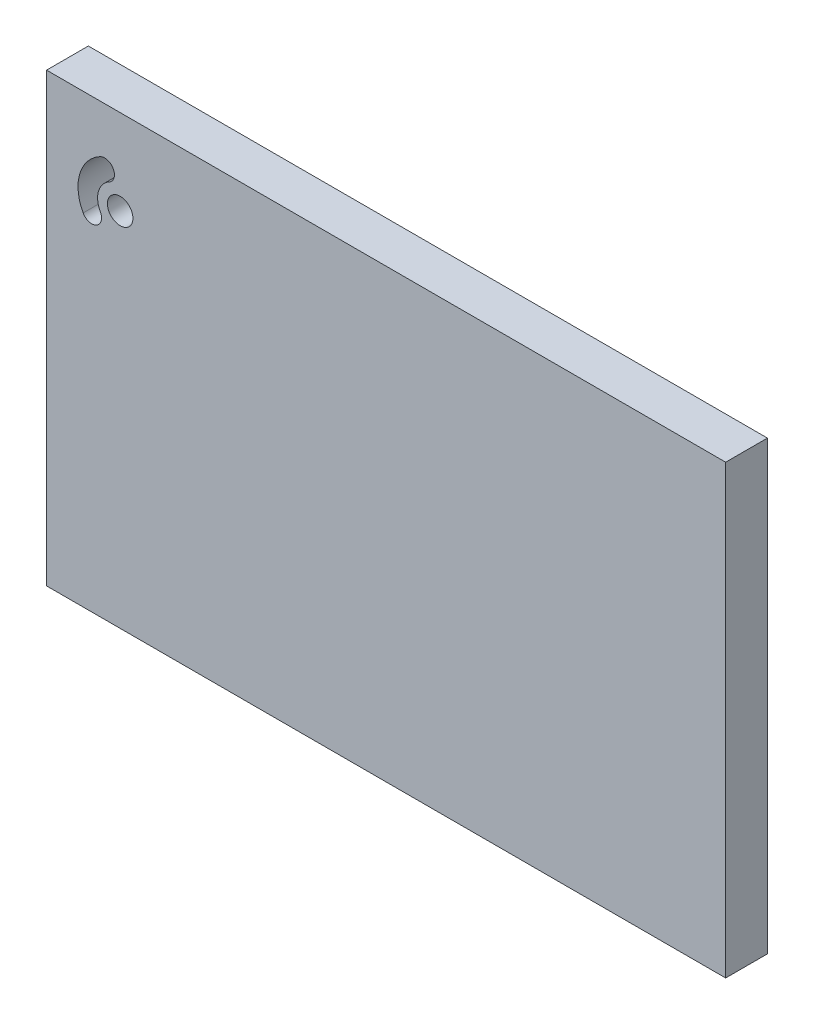
ISO-10303-21;
HEADER;
FILE_DESCRIPTION(('STEP AP214'),'2;1');
FILE_NAME('part.step','',(''),(''),'','','');
FILE_SCHEMA(('AUTOMOTIVE_DESIGN { 1 0 10303 214 1 1 1 1 }'));
ENDSEC;
DATA;
#1=APPLICATION_CONTEXT('core data for automotive mechanical design processes');
#2=APPLICATION_PROTOCOL_DEFINITION('international standard','automotive_design',2000,#1);
#3=PRODUCT_CONTEXT('',#1,'mechanical');
#4=PRODUCT('Part','Part','',(#3));
#5=PRODUCT_RELATED_PRODUCT_CATEGORY('part','',(#4));
#6=PRODUCT_DEFINITION_FORMATION('','',#4);
#7=PRODUCT_DEFINITION_CONTEXT('part definition',#1,'design');
#8=PRODUCT_DEFINITION('design','',#6,#7);
#9=PRODUCT_DEFINITION_SHAPE('','',#8);
#10=(LENGTH_UNIT() NAMED_UNIT(*) SI_UNIT(.MILLI.,.METRE.));
#11=(NAMED_UNIT(*) PLANE_ANGLE_UNIT() SI_UNIT($,.RADIAN.));
#12=(NAMED_UNIT(*) SI_UNIT($,.STERADIAN.) SOLID_ANGLE_UNIT());
#13=UNCERTAINTY_MEASURE_WITH_UNIT(LENGTH_MEASURE(1.E-05),#10,'distance_accuracy_value','');
#14=(GEOMETRIC_REPRESENTATION_CONTEXT(3) GLOBAL_UNCERTAINTY_ASSIGNED_CONTEXT((#13)) GLOBAL_UNIT_ASSIGNED_CONTEXT((#10,
#11,#12)) REPRESENTATION_CONTEXT('',''));
#15=CARTESIAN_POINT('',(0.,0.,0.));
#16=DIRECTION('',(0.,0.,1.));
#17=DIRECTION('',(1.,0.,0.));
#18=AXIS2_PLACEMENT_3D('',#15,#16,#17);
#19=CARTESIAN_POINT('',(0.,0.,10.));
#20=DIRECTION('',(0.,0.,1.));
#21=DIRECTION('',(1.,0.,0.));
#22=AXIS2_PLACEMENT_3D('',#19,#20,#21);
#23=PLANE('',#22);
#24=CARTESIAN_POINT('',(-22.101373353219,28.4381307481979,10.));
#25=DIRECTION('',(0.,0.,1.));
#26=DIRECTION('',(1.,0.,0.));
#27=AXIS2_PLACEMENT_3D('',#24,#25,#26);
#28=CIRCLE('',#27,10.0923388057999);
#29=CARTESIAN_POINT('',(-26.9341112939265,37.2981503061616,10.));
#30=VERTEX_POINT('',#29);
#31=CARTESIAN_POINT('',(-30.9613929111828,23.6053928074904,10.));
#32=VERTEX_POINT('',#31);
#33=EDGE_CURVE('E110',#30,#32,#28,.T.);
#34=ORIENTED_EDGE('',*,*,#33,.F.);
#35=CARTESIAN_POINT('',(-25.8106947551578,35.2385533184191,10.));
#36=DIRECTION('',(0.,0.,1.));
#37=DIRECTION('',(1.,0.,0.));
#38=AXIS2_PLACEMENT_3D('',#35,#36,#37);
#39=CIRCLE('',#38,2.34606148075814);
#40=CARTESIAN_POINT('',(-24.6872782163892,33.1789563306765,10.));
#41=VERTEX_POINT('',#40);
#42=EDGE_CURVE('E102',#41,#30,#39,.T.);
#43=ORIENTED_EDGE('',*,*,#42,.F.);
#44=CARTESIAN_POINT('',(-22.101373353219,28.4381307481979,10.));
#45=DIRECTION('',(0.,0.,-1.));
#46=DIRECTION('',(1.,0.,0.));
#47=AXIS2_PLACEMENT_3D('',#44,#45,#46);
#48=CIRCLE('',#47,5.40021584428362);
#49=CARTESIAN_POINT('',(-26.8421989356977,25.8522258850277,10.));
#50=VERTEX_POINT('',#49);
#51=EDGE_CURVE('E125',#50,#41,#48,.T.);
#52=ORIENTED_EDGE('',*,*,#51,.F.);
#53=CARTESIAN_POINT('',(-28.9017959234402,24.728809346259,10.));
#54=DIRECTION('',(0.,0.,1.));
#55=DIRECTION('',(1.,0.,0.));
#56=AXIS2_PLACEMENT_3D('',#53,#54,#55);
#57=CIRCLE('',#56,2.34606148075815);
#58=EDGE_CURVE('E123',#32,#50,#57,.T.);
#59=ORIENTED_EDGE('',*,*,#58,.F.);
#60=EDGE_LOOP('',(#34,#43,#52,#59));
#61=FACE_BOUND('',#60,.T.);
#62=DIRECTION('',(0.,-1.,0.));
#63=VECTOR('',#62,1.);
#64=CARTESIAN_POINT('',(-39.7206500124286,48.8393984588616,10.));
#65=LINE('',#64,#63);
#66=CARTESIAN_POINT('',(-39.7206500124286,48.8393984588616,10.));
#67=VERTEX_POINT('',#66);
#68=CARTESIAN_POINT('',(-39.7206500124286,-58.1127019637087,10.));
#69=VERTEX_POINT('',#68);
#70=EDGE_CURVE('E141',#67,#69,#65,.T.);
#71=ORIENTED_EDGE('',*,*,#70,.T.);
#72=DIRECTION('',(1.,0.,0.));
#73=VECTOR('',#72,1.);
#74=CARTESIAN_POINT('',(-39.7206500124286,-58.1127019637087,10.));
#75=LINE('',#74,#73);
#76=CARTESIAN_POINT('',(122.871271439224,-58.1127019637087,10.));
#77=VERTEX_POINT('',#76);
#78=EDGE_CURVE('E144',#69,#77,#75,.T.);
#79=ORIENTED_EDGE('',*,*,#78,.T.);
#80=DIRECTION('',(0.,1.,0.));
#81=VECTOR('',#80,1.);
#82=CARTESIAN_POINT('',(122.871271439224,48.8393984588616,10.));
#83=LINE('',#82,#81);
#84=CARTESIAN_POINT('',(122.871271439224,48.8393984588616,10.));
#85=VERTEX_POINT('',#84);
#86=EDGE_CURVE('E147',#77,#85,#83,.T.);
#87=ORIENTED_EDGE('',*,*,#86,.T.);
#88=DIRECTION('',(-1.,0.,0.));
#89=VECTOR('',#88,1.);
#90=CARTESIAN_POINT('',(-39.7206500124286,48.8393984588616,10.));
#91=LINE('',#90,#89);
#92=EDGE_CURVE('E149',#85,#67,#91,.T.);
#93=ORIENTED_EDGE('',*,*,#92,.T.);
#94=EDGE_LOOP('',(#71,#79,#87,#93));
#95=FACE_BOUND('',#94,.T.);
#96=CARTESIAN_POINT('',(-22.101373353219,28.4381307481979,10.));
#97=DIRECTION('',(0.,0.,1.));
#98=DIRECTION('',(1.,0.,0.));
#99=AXIS2_PLACEMENT_3D('',#96,#97,#98);
#100=CIRCLE('',#99,3.05289923588758);
#101=CARTESIAN_POINT('',(-19.0484741173314,28.4381307481979,10.));
#102=VERTEX_POINT('',#101);
#103=EDGE_CURVE('E131',#102,#102,#100,.T.);
#104=ORIENTED_EDGE('',*,*,#103,.F.);
#105=EDGE_LOOP('',(#104));
#106=FACE_BOUND('',#105,.T.);
#107=ADVANCED_FACE('F37',(#61,#95,#106),#23,.T.);
#108=CARTESIAN_POINT('',(0.,0.,0.));
#109=DIRECTION('',(0.,0.,1.));
#110=DIRECTION('',(1.,0.,0.));
#111=AXIS2_PLACEMENT_3D('',#108,#109,#110);
#112=PLANE('',#111);
#113=DIRECTION('',(0.,-1.,0.));
#114=VECTOR('',#113,1.);
#115=CARTESIAN_POINT('',(-39.7206500124286,48.8393984588616,0.));
#116=LINE('',#115,#114);
#117=CARTESIAN_POINT('',(-39.7206500124286,48.8393984588616,0.));
#118=VERTEX_POINT('',#117);
#119=CARTESIAN_POINT('',(-39.7206500124286,-58.1127019637087,0.));
#120=VERTEX_POINT('',#119);
#121=EDGE_CURVE('E118',#118,#120,#116,.T.);
#122=ORIENTED_EDGE('',*,*,#121,.F.);
#123=DIRECTION('',(-1.,0.,0.));
#124=VECTOR('',#123,1.);
#125=CARTESIAN_POINT('',(-39.7206500124286,48.8393984588616,0.));
#126=LINE('',#125,#124);
#127=CARTESIAN_POINT('',(122.871271439224,48.8393984588616,0.));
#128=VERTEX_POINT('',#127);
#129=EDGE_CURVE('E145',#128,#118,#126,.T.);
#130=ORIENTED_EDGE('',*,*,#129,.F.);
#131=DIRECTION('',(0.,1.,0.));
#132=VECTOR('',#131,1.);
#133=CARTESIAN_POINT('',(122.871271439224,48.8393984588616,0.));
#134=LINE('',#133,#132);
#135=CARTESIAN_POINT('',(122.871271439224,-58.1127019637087,0.));
#136=VERTEX_POINT('',#135);
#137=EDGE_CURVE('E156',#136,#128,#134,.T.);
#138=ORIENTED_EDGE('',*,*,#137,.F.);
#139=DIRECTION('',(1.,0.,0.));
#140=VECTOR('',#139,1.);
#141=CARTESIAN_POINT('',(-39.7206500124286,-58.1127019637087,0.));
#142=LINE('',#141,#140);
#143=EDGE_CURVE('E154',#120,#136,#142,.T.);
#144=ORIENTED_EDGE('',*,*,#143,.F.);
#145=EDGE_LOOP('',(#122,#130,#138,#144));
#146=FACE_BOUND('',#145,.T.);
#147=CARTESIAN_POINT('',(-25.8106947551578,35.2385533184191,0.));
#148=DIRECTION('',(0.,0.,1.));
#149=DIRECTION('',(1.,0.,0.));
#150=AXIS2_PLACEMENT_3D('',#147,#148,#149);
#151=CIRCLE('',#150,2.34606148075814);
#152=CARTESIAN_POINT('',(-24.6872782163892,33.1789563306765,0.));
#153=VERTEX_POINT('',#152);
#154=CARTESIAN_POINT('',(-26.9341112939265,37.2981503061616,0.));
#155=VERTEX_POINT('',#154);
#156=EDGE_CURVE('E60',#153,#155,#151,.T.);
#157=ORIENTED_EDGE('',*,*,#156,.T.);
#158=CARTESIAN_POINT('',(-22.101373353219,28.4381307481979,0.));
#159=DIRECTION('',(0.,0.,1.));
#160=DIRECTION('',(1.,0.,0.));
#161=AXIS2_PLACEMENT_3D('',#158,#159,#160);
#162=CIRCLE('',#161,10.0923388057999);
#163=CARTESIAN_POINT('',(-30.9613929111828,23.6053928074904,0.));
#164=VERTEX_POINT('',#163);
#165=EDGE_CURVE('E117',#155,#164,#162,.T.);
#166=ORIENTED_EDGE('',*,*,#165,.T.);
#167=CARTESIAN_POINT('',(-28.9017959234402,24.728809346259,0.));
#168=DIRECTION('',(0.,0.,1.));
#169=DIRECTION('',(1.,0.,0.));
#170=AXIS2_PLACEMENT_3D('',#167,#168,#169);
#171=CIRCLE('',#170,2.34606148075815);
#172=CARTESIAN_POINT('',(-26.8421989356977,25.8522258850277,0.));
#173=VERTEX_POINT('',#172);
#174=EDGE_CURVE('E133',#164,#173,#171,.T.);
#175=ORIENTED_EDGE('',*,*,#174,.T.);
#176=CARTESIAN_POINT('',(-22.101373353219,28.4381307481979,0.));
#177=DIRECTION('',(0.,0.,-1.));
#178=DIRECTION('',(1.,0.,0.));
#179=AXIS2_PLACEMENT_3D('',#176,#177,#178);
#180=CIRCLE('',#179,5.40021584428362);
#181=EDGE_CURVE('E111',#173,#153,#180,.T.);
#182=ORIENTED_EDGE('',*,*,#181,.T.);
#183=EDGE_LOOP('',(#157,#166,#175,#182));
#184=FACE_BOUND('',#183,.T.);
#185=CARTESIAN_POINT('',(-22.101373353219,28.4381307481979,0.));
#186=DIRECTION('',(0.,0.,1.));
#187=DIRECTION('',(1.,0.,0.));
#188=AXIS2_PLACEMENT_3D('',#185,#186,#187);
#189=CIRCLE('',#188,3.05289923588758);
#190=CARTESIAN_POINT('',(-19.0484741173314,28.4381307481979,0.));
#191=VERTEX_POINT('',#190);
#192=EDGE_CURVE('E227',#191,#191,#189,.T.);
#193=ORIENTED_EDGE('',*,*,#192,.T.);
#194=EDGE_LOOP('',(#193));
#195=FACE_BOUND('',#194,.T.);
#196=ADVANCED_FACE('F174',(#146,#184,#195),#112,.F.);
#197=CARTESIAN_POINT('',(-39.7206500124286,48.8393984588616,10.));
#198=DIRECTION('',(1.,0.,0.));
#199=DIRECTION('',(0.,0.,-1.));
#200=AXIS2_PLACEMENT_3D('',#197,#198,#199);
#201=PLANE('',#200);
#202=ORIENTED_EDGE('',*,*,#121,.T.);
#203=DIRECTION('',(0.,0.,-1.));
#204=VECTOR('',#203,1.);
#205=CARTESIAN_POINT('',(-39.7206500124286,-58.1127019637087,10.));
#206=LINE('',#205,#204);
#207=EDGE_CURVE('E11',#69,#120,#206,.T.);
#208=ORIENTED_EDGE('',*,*,#207,.F.);
#209=ORIENTED_EDGE('',*,*,#70,.F.);
#210=DIRECTION('',(0.,0.,-1.));
#211=VECTOR('',#210,1.);
#212=CARTESIAN_POINT('',(-39.7206500124286,48.8393984588616,10.));
#213=LINE('',#212,#211);
#214=EDGE_CURVE('E151',#67,#118,#213,.T.);
#215=ORIENTED_EDGE('',*,*,#214,.T.);
#216=EDGE_LOOP('',(#202,#208,#209,#215));
#217=FACE_BOUND('',#216,.T.);
#218=ADVANCED_FACE('F39',(#217),#201,.F.);
#219=CARTESIAN_POINT('',(-39.7206500124286,-58.1127019637087,10.));
#220=DIRECTION('',(0.,1.,0.));
#221=DIRECTION('',(0.,0.,1.));
#222=AXIS2_PLACEMENT_3D('',#219,#220,#221);
#223=PLANE('',#222);
#224=ORIENTED_EDGE('',*,*,#143,.T.);
#225=DIRECTION('',(0.,0.,-1.));
#226=VECTOR('',#225,1.);
#227=CARTESIAN_POINT('',(122.871271439224,-58.1127019637087,10.));
#228=LINE('',#227,#226);
#229=EDGE_CURVE('E45',#77,#136,#228,.T.);
#230=ORIENTED_EDGE('',*,*,#229,.F.);
#231=ORIENTED_EDGE('',*,*,#78,.F.);
#232=ORIENTED_EDGE('',*,*,#207,.T.);
#233=EDGE_LOOP('',(#224,#230,#231,#232));
#234=FACE_BOUND('',#233,.T.);
#235=ADVANCED_FACE('F184',(#234),#223,.F.);
#236=CARTESIAN_POINT('',(122.871271439224,48.8393984588616,10.));
#237=DIRECTION('',(-1.,0.,0.));
#238=DIRECTION('',(0.,0.,1.));
#239=AXIS2_PLACEMENT_3D('',#236,#237,#238);
#240=PLANE('',#239);
#241=ORIENTED_EDGE('',*,*,#137,.T.);
#242=DIRECTION('',(0.,0.,-1.));
#243=VECTOR('',#242,1.);
#244=CARTESIAN_POINT('',(122.871271439224,48.8393984588616,10.));
#245=LINE('',#244,#243);
#246=EDGE_CURVE('E161',#85,#128,#245,.T.);
#247=ORIENTED_EDGE('',*,*,#246,.F.);
#248=ORIENTED_EDGE('',*,*,#86,.F.);
#249=ORIENTED_EDGE('',*,*,#229,.T.);
#250=EDGE_LOOP('',(#241,#247,#248,#249));
#251=FACE_BOUND('',#250,.T.);
#252=ADVANCED_FACE('F168',(#251),#240,.F.);
#253=CARTESIAN_POINT('',(-39.7206500124286,48.8393984588616,10.));
#254=DIRECTION('',(0.,-1.,0.));
#255=DIRECTION('',(0.,0.,-1.));
#256=AXIS2_PLACEMENT_3D('',#253,#254,#255);
#257=PLANE('',#256);
#258=ORIENTED_EDGE('',*,*,#129,.T.);
#259=ORIENTED_EDGE('',*,*,#214,.F.);
#260=ORIENTED_EDGE('',*,*,#92,.F.);
#261=ORIENTED_EDGE('',*,*,#246,.T.);
#262=EDGE_LOOP('',(#258,#259,#260,#261));
#263=FACE_BOUND('',#262,.T.);
#264=ADVANCED_FACE('F178',(#263),#257,.F.);
#265=CARTESIAN_POINT('',(-25.8106947551578,35.2385533184191,10.));
#266=DIRECTION('',(0.,0.,-1.));
#267=DIRECTION('',(-1.,0.,0.));
#268=AXIS2_PLACEMENT_3D('',#265,#266,#267);
#269=CYLINDRICAL_SURFACE('',#268,2.34606148075814);
#270=ORIENTED_EDGE('',*,*,#156,.F.);
#271=DIRECTION('',(0.,0.,-1.));
#272=VECTOR('',#271,1.);
#273=CARTESIAN_POINT('',(-24.6872782163892,33.1789563306765,10.));
#274=LINE('',#273,#272);
#275=EDGE_CURVE('E106',#41,#153,#274,.T.);
#276=ORIENTED_EDGE('',*,*,#275,.F.);
#277=ORIENTED_EDGE('',*,*,#42,.T.);
#278=DIRECTION('',(0.,0.,-1.));
#279=VECTOR('',#278,1.);
#280=CARTESIAN_POINT('',(-26.9341112939265,37.2981503061616,10.));
#281=LINE('',#280,#279);
#282=EDGE_CURVE('E105',#30,#155,#281,.T.);
#283=ORIENTED_EDGE('',*,*,#282,.T.);
#284=EDGE_LOOP('',(#270,#276,#277,#283));
#285=FACE_BOUND('',#284,.T.);
#286=ADVANCED_FACE('F104',(#285),#269,.F.);
#287=CARTESIAN_POINT('',(-22.101373353219,28.4381307481979,10.));
#288=DIRECTION('',(0.,0.,-1.));
#289=DIRECTION('',(-1.,0.,0.));
#290=AXIS2_PLACEMENT_3D('',#287,#288,#289);
#291=CYLINDRICAL_SURFACE('',#290,10.0923388057999);
#292=ORIENTED_EDGE('',*,*,#165,.F.);
#293=ORIENTED_EDGE('',*,*,#282,.F.);
#294=ORIENTED_EDGE('',*,*,#33,.T.);
#295=DIRECTION('',(0.,0.,-1.));
#296=VECTOR('',#295,1.);
#297=CARTESIAN_POINT('',(-30.9613929111828,23.6053928074904,10.));
#298=LINE('',#297,#296);
#299=EDGE_CURVE('E119',#32,#164,#298,.T.);
#300=ORIENTED_EDGE('',*,*,#299,.T.);
#301=EDGE_LOOP('',(#292,#293,#294,#300));
#302=FACE_BOUND('',#301,.T.);
#303=ADVANCED_FACE('F114',(#302),#291,.F.);
#304=CARTESIAN_POINT('',(-28.9017959234402,24.728809346259,10.));
#305=DIRECTION('',(0.,0.,-1.));
#306=DIRECTION('',(-1.,0.,0.));
#307=AXIS2_PLACEMENT_3D('',#304,#305,#306);
#308=CYLINDRICAL_SURFACE('',#307,2.34606148075815);
#309=ORIENTED_EDGE('',*,*,#174,.F.);
#310=ORIENTED_EDGE('',*,*,#299,.F.);
#311=ORIENTED_EDGE('',*,*,#58,.T.);
#312=DIRECTION('',(0.,0.,-1.));
#313=VECTOR('',#312,1.);
#314=CARTESIAN_POINT('',(-26.8421989356977,25.8522258850277,10.));
#315=LINE('',#314,#313);
#316=EDGE_CURVE('E52',#50,#173,#315,.T.);
#317=ORIENTED_EDGE('',*,*,#316,.T.);
#318=EDGE_LOOP('',(#309,#310,#311,#317));
#319=FACE_BOUND('',#318,.T.);
#320=ADVANCED_FACE('F207',(#319),#308,.F.);
#321=CARTESIAN_POINT('',(-22.101373353219,28.4381307481979,10.));
#322=DIRECTION('',(0.,0.,-1.));
#323=DIRECTION('',(-1.,0.,0.));
#324=AXIS2_PLACEMENT_3D('',#321,#322,#323);
#325=CYLINDRICAL_SURFACE('',#324,5.40021584428362);
#326=ORIENTED_EDGE('',*,*,#181,.F.);
#327=ORIENTED_EDGE('',*,*,#316,.F.);
#328=ORIENTED_EDGE('',*,*,#51,.T.);
#329=ORIENTED_EDGE('',*,*,#275,.T.);
#330=EDGE_LOOP('',(#326,#327,#328,#329));
#331=FACE_BOUND('',#330,.T.);
#332=ADVANCED_FACE('F211',(#331),#325,.T.);
#333=CARTESIAN_POINT('',(-22.101373353219,28.4381307481979,10.));
#334=DIRECTION('',(0.,0.,-1.));
#335=DIRECTION('',(-1.,0.,0.));
#336=AXIS2_PLACEMENT_3D('',#333,#334,#335);
#337=CYLINDRICAL_SURFACE('',#336,3.05289923588758);
#338=ORIENTED_EDGE('',*,*,#103,.T.);
#339=EDGE_LOOP('',(#338));
#340=FACE_BOUND('',#339,.T.);
#341=ORIENTED_EDGE('',*,*,#192,.F.);
#342=EDGE_LOOP('',(#341));
#343=FACE_BOUND('',#342,.T.);
#344=ADVANCED_FACE('F217',(#340,#343),#337,.F.);
#345=CLOSED_SHELL('',(#107,#196,#218,#235,#252,#264,#286,#303,#320,#332,#344));
#346=MANIFOLD_SOLID_BREP('B2',#345);
#347=ADVANCED_BREP_SHAPE_REPRESENTATION('',(#18,#346),#14);
#348=SHAPE_DEFINITION_REPRESENTATION(#9,#347);
ENDSEC;
END-ISO-10303-21;
